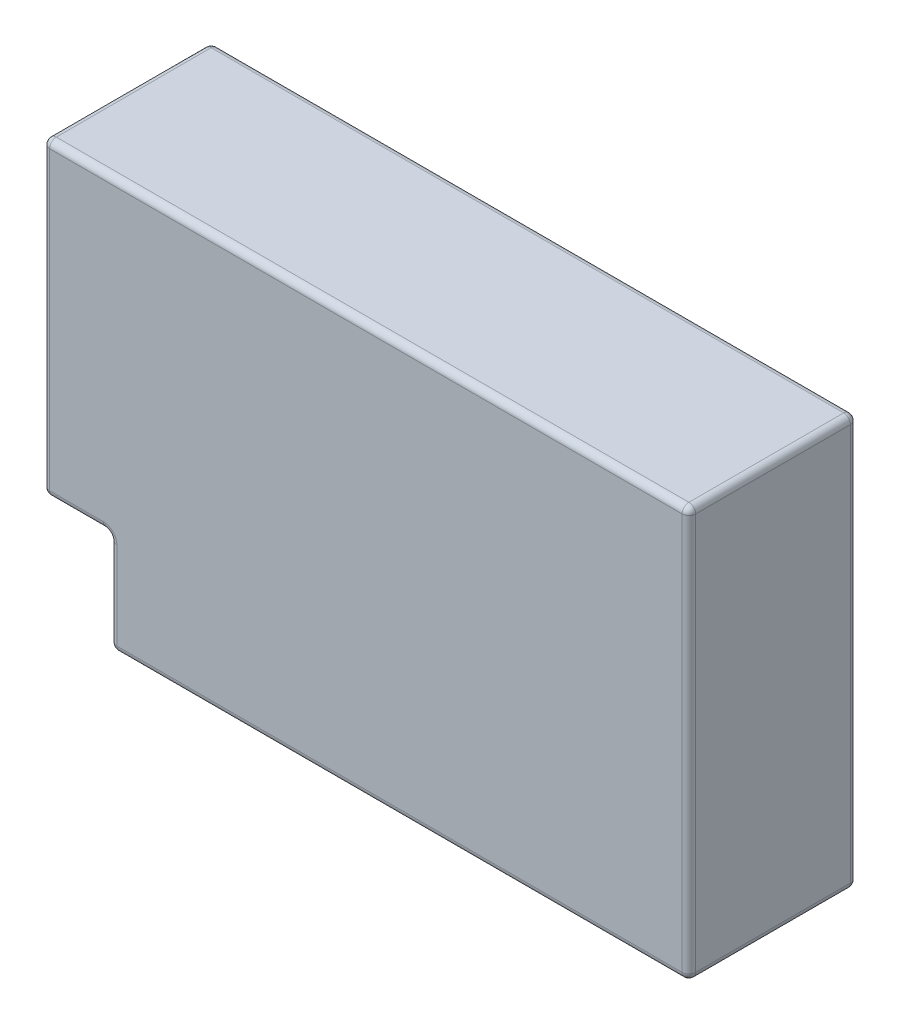
ISO-10303-21;
HEADER;
FILE_DESCRIPTION(('STEP AP214'),'2;1');
FILE_NAME('part.step','',(''),(''),'','','');
FILE_SCHEMA(('AUTOMOTIVE_DESIGN { 1 0 10303 214 1 1 1 1 }'));
ENDSEC;
DATA;
#1=APPLICATION_CONTEXT('core data for automotive mechanical design processes');
#2=APPLICATION_PROTOCOL_DEFINITION('international standard','automotive_design',2000,#1);
#3=PRODUCT_CONTEXT('',#1,'mechanical');
#4=PRODUCT('Part','Part','',(#3));
#5=PRODUCT_RELATED_PRODUCT_CATEGORY('part','',(#4));
#6=PRODUCT_DEFINITION_FORMATION('','',#4);
#7=PRODUCT_DEFINITION_CONTEXT('part definition',#1,'design');
#8=PRODUCT_DEFINITION('design','',#6,#7);
#9=PRODUCT_DEFINITION_SHAPE('','',#8);
#10=(LENGTH_UNIT() NAMED_UNIT(*) SI_UNIT(.MILLI.,.METRE.));
#11=(NAMED_UNIT(*) PLANE_ANGLE_UNIT() SI_UNIT($,.RADIAN.));
#12=(NAMED_UNIT(*) SI_UNIT($,.STERADIAN.) SOLID_ANGLE_UNIT());
#13=UNCERTAINTY_MEASURE_WITH_UNIT(LENGTH_MEASURE(1.E-05),#10,'distance_accuracy_value','');
#14=(GEOMETRIC_REPRESENTATION_CONTEXT(3) GLOBAL_UNCERTAINTY_ASSIGNED_CONTEXT((#13)) GLOBAL_UNIT_ASSIGNED_CONTEXT((#10,
#11,#12)) REPRESENTATION_CONTEXT('',''));
#15=CARTESIAN_POINT('',(0.,0.,0.));
#16=DIRECTION('',(0.,0.,1.));
#17=DIRECTION('',(1.,0.,0.));
#18=AXIS2_PLACEMENT_3D('',#15,#16,#17);
#19=CARTESIAN_POINT('',(-34.4784061836818,29.89401972873,25.));
#20=DIRECTION('',(0.,-1.,0.));
#21=DIRECTION('',(0.,0.,-1.));
#22=AXIS2_PLACEMENT_3D('',#19,#20,#21);
#23=PLANE('',#22);
#24=DIRECTION('',(0.,0.,-1.));
#25=VECTOR('',#24,1.);
#26=CARTESIAN_POINT('',(-33.4784061836818,29.89401972873,25.));
#27=LINE('',#26,#25);
#28=CARTESIAN_POINT('',(-33.4784061836818,29.89401972873,1.));
#29=VERTEX_POINT('',#28);
#30=CARTESIAN_POINT('',(-33.4784061836818,29.89401972873,24.));
#31=VERTEX_POINT('',#30);
#32=EDGE_CURVE('E170',#29,#31,#27,.F.);
#33=ORIENTED_EDGE('',*,*,#32,.T.);
#34=DIRECTION('',(-1.,0.,0.));
#35=VECTOR('',#34,1.);
#36=CARTESIAN_POINT('',(-34.4784061836818,29.89401972873,24.));
#37=LINE('',#36,#35);
#38=CARTESIAN_POINT('',(60.5215938163182,29.89401972873,24.));
#39=VERTEX_POINT('',#38);
#40=EDGE_CURVE('E207',#31,#39,#37,.F.);
#41=ORIENTED_EDGE('',*,*,#40,.T.);
#42=DIRECTION('',(0.,0.,-1.));
#43=VECTOR('',#42,1.);
#44=CARTESIAN_POINT('',(60.5215938163182,29.89401972873,25.));
#45=LINE('',#44,#43);
#46=CARTESIAN_POINT('',(60.5215938163182,29.89401972873,1.));
#47=VERTEX_POINT('',#46);
#48=EDGE_CURVE('E204',#39,#47,#45,.T.);
#49=ORIENTED_EDGE('',*,*,#48,.T.);
#50=DIRECTION('',(-1.,0.,0.));
#51=VECTOR('',#50,1.);
#52=CARTESIAN_POINT('',(-34.4784061836818,29.89401972873,1.));
#53=LINE('',#52,#51);
#54=EDGE_CURVE('E199',#47,#29,#53,.T.);
#55=ORIENTED_EDGE('',*,*,#54,.T.);
#56=EDGE_LOOP('',(#33,#41,#49,#55));
#57=FACE_BOUND('',#56,.T.);
#58=ADVANCED_FACE('F33',(#57),#23,.F.);
#59=CARTESIAN_POINT('',(-34.4784061836818,29.89401972873,25.));
#60=DIRECTION('',(1.,0.,0.));
#61=DIRECTION('',(0.,0.,-1.));
#62=AXIS2_PLACEMENT_3D('',#59,#60,#61);
#63=PLANE('',#62);
#64=DIRECTION('',(0.,0.,-1.));
#65=VECTOR('',#64,1.);
#66=CARTESIAN_POINT('',(-34.4784061836818,-15.10598027127,25.));
#67=LINE('',#66,#65);
#68=CARTESIAN_POINT('',(-34.4784061836818,-15.10598027127,1.));
#69=VERTEX_POINT('',#68);
#70=CARTESIAN_POINT('',(-34.4784061836818,-15.10598027127,24.));
#71=VERTEX_POINT('',#70);
#72=EDGE_CURVE('E192',#69,#71,#67,.F.);
#73=ORIENTED_EDGE('',*,*,#72,.T.);
#74=DIRECTION('',(0.,-1.,0.));
#75=VECTOR('',#74,1.);
#76=CARTESIAN_POINT('',(-34.4784061836818,29.89401972873,24.));
#77=LINE('',#76,#75);
#78=CARTESIAN_POINT('',(-34.4784061836818,28.89401972873,24.));
#79=VERTEX_POINT('',#78);
#80=EDGE_CURVE('E196',#71,#79,#77,.F.);
#81=ORIENTED_EDGE('',*,*,#80,.T.);
#82=DIRECTION('',(0.,0.,-1.));
#83=VECTOR('',#82,1.);
#84=CARTESIAN_POINT('',(-34.4784061836818,28.89401972873,25.));
#85=LINE('',#84,#83);
#86=CARTESIAN_POINT('',(-34.4784061836818,28.89401972873,1.));
#87=VERTEX_POINT('',#86);
#88=EDGE_CURVE('E168',#79,#87,#85,.T.);
#89=ORIENTED_EDGE('',*,*,#88,.T.);
#90=DIRECTION('',(0.,-1.,0.));
#91=VECTOR('',#90,1.);
#92=CARTESIAN_POINT('',(-34.4784061836818,-16.10598027127,1.));
#93=LINE('',#92,#91);
#94=EDGE_CURVE('E186',#87,#69,#93,.T.);
#95=ORIENTED_EDGE('',*,*,#94,.T.);
#96=EDGE_LOOP('',(#73,#81,#89,#95));
#97=FACE_BOUND('',#96,.T.);
#98=ADVANCED_FACE('F194',(#97),#63,.F.);
#99=CARTESIAN_POINT('',(-34.4784061836818,-16.10598027127,25.));
#100=DIRECTION('',(0.,1.,0.));
#101=DIRECTION('',(0.,0.,1.));
#102=AXIS2_PLACEMENT_3D('',#99,#100,#101);
#103=PLANE('',#102);
#104=DIRECTION('',(0.,0.,-1.));
#105=VECTOR('',#104,1.);
#106=CARTESIAN_POINT('',(-25.4784061836818,-16.10598027127,25.));
#107=LINE('',#106,#105);
#108=CARTESIAN_POINT('',(-25.4784061836818,-16.10598027127,1.));
#109=VERTEX_POINT('',#108);
#110=CARTESIAN_POINT('',(-25.4784061836818,-16.10598027127,24.));
#111=VERTEX_POINT('',#110);
#112=EDGE_CURVE('E211',#109,#111,#107,.F.);
#113=ORIENTED_EDGE('',*,*,#112,.T.);
#114=DIRECTION('',(1.,0.,0.));
#115=VECTOR('',#114,1.);
#116=CARTESIAN_POINT('',(-34.4784061836818,-16.10598027127,24.));
#117=LINE('',#116,#115);
#118=CARTESIAN_POINT('',(-33.4784061836818,-16.10598027127,24.));
#119=VERTEX_POINT('',#118);
#120=EDGE_CURVE('E216',#111,#119,#117,.F.);
#121=ORIENTED_EDGE('',*,*,#120,.T.);
#122=DIRECTION('',(0.,0.,-1.));
#123=VECTOR('',#122,1.);
#124=CARTESIAN_POINT('',(-33.4784061836818,-16.10598027127,25.));
#125=LINE('',#124,#123);
#126=CARTESIAN_POINT('',(-33.4784061836818,-16.10598027127,1.));
#127=VERTEX_POINT('',#126);
#128=EDGE_CURVE('E213',#119,#127,#125,.T.);
#129=ORIENTED_EDGE('',*,*,#128,.T.);
#130=DIRECTION('',(1.,0.,0.));
#131=VECTOR('',#130,1.);
#132=CARTESIAN_POINT('',(-24.4784061836818,-16.10598027127,1.));
#133=LINE('',#132,#131);
#134=EDGE_CURVE('E209',#127,#109,#133,.T.);
#135=ORIENTED_EDGE('',*,*,#134,.T.);
#136=EDGE_LOOP('',(#113,#121,#129,#135));
#137=FACE_BOUND('',#136,.T.);
#138=ADVANCED_FACE('F456',(#137),#103,.F.);
#139=CARTESIAN_POINT('',(-24.4784061836818,-31.10598027127,25.));
#140=DIRECTION('',(1.,0.,0.));
#141=DIRECTION('',(0.,0.,-1.));
#142=AXIS2_PLACEMENT_3D('',#139,#140,#141);
#143=PLANE('',#142);
#144=DIRECTION('',(0.,0.,-1.));
#145=VECTOR('',#144,1.);
#146=CARTESIAN_POINT('',(-24.4784061836818,-30.10598027127,25.));
#147=LINE('',#146,#145);
#148=CARTESIAN_POINT('',(-24.4784061836818,-30.10598027127,1.));
#149=VERTEX_POINT('',#148);
#150=CARTESIAN_POINT('',(-24.4784061836818,-30.10598027127,24.));
#151=VERTEX_POINT('',#150);
#152=EDGE_CURVE('E220',#149,#151,#147,.F.);
#153=ORIENTED_EDGE('',*,*,#152,.T.);
#154=DIRECTION('',(0.,-1.,0.));
#155=VECTOR('',#154,1.);
#156=CARTESIAN_POINT('',(-24.4784061836818,-31.10598027127,24.));
#157=LINE('',#156,#155);
#158=CARTESIAN_POINT('',(-24.4784061836818,-17.10598027127,24.));
#159=VERTEX_POINT('',#158);
#160=EDGE_CURVE('E225',#151,#159,#157,.F.);
#161=ORIENTED_EDGE('',*,*,#160,.T.);
#162=DIRECTION('',(0.,0.,-1.));
#163=VECTOR('',#162,1.);
#164=CARTESIAN_POINT('',(-24.4784061836818,-17.10598027127,0.));
#165=LINE('',#164,#163);
#166=CARTESIAN_POINT('',(-24.4784061836818,-17.10598027127,1.));
#167=VERTEX_POINT('',#166);
#168=EDGE_CURVE('E222',#159,#167,#165,.T.);
#169=ORIENTED_EDGE('',*,*,#168,.T.);
#170=DIRECTION('',(0.,-1.,0.));
#171=VECTOR('',#170,1.);
#172=CARTESIAN_POINT('',(-24.4784061836818,-31.10598027127,1.));
#173=LINE('',#172,#171);
#174=EDGE_CURVE('E218',#167,#149,#173,.T.);
#175=ORIENTED_EDGE('',*,*,#174,.T.);
#176=EDGE_LOOP('',(#153,#161,#169,#175));
#177=FACE_BOUND('',#176,.T.);
#178=ADVANCED_FACE('F390',(#177),#143,.F.);
#179=CARTESIAN_POINT('',(-24.4784061836818,-31.10598027127,25.));
#180=DIRECTION('',(0.,1.,0.));
#181=DIRECTION('',(0.,0.,1.));
#182=AXIS2_PLACEMENT_3D('',#179,#180,#181);
#183=PLANE('',#182);
#184=DIRECTION('',(0.,0.,-1.));
#185=VECTOR('',#184,1.);
#186=CARTESIAN_POINT('',(60.5215938163182,-31.10598027127,25.));
#187=LINE('',#186,#185);
#188=CARTESIAN_POINT('',(60.5215938163182,-31.10598027127,1.));
#189=VERTEX_POINT('',#188);
#190=CARTESIAN_POINT('',(60.5215938163182,-31.10598027127,24.));
#191=VERTEX_POINT('',#190);
#192=EDGE_CURVE('E229',#189,#191,#187,.F.);
#193=ORIENTED_EDGE('',*,*,#192,.T.);
#194=DIRECTION('',(1.,0.,0.));
#195=VECTOR('',#194,1.);
#196=CARTESIAN_POINT('',(-24.4784061836818,-31.10598027127,24.));
#197=LINE('',#196,#195);
#198=CARTESIAN_POINT('',(-23.4784061836818,-31.10598027127,24.));
#199=VERTEX_POINT('',#198);
#200=EDGE_CURVE('E234',#191,#199,#197,.F.);
#201=ORIENTED_EDGE('',*,*,#200,.T.);
#202=DIRECTION('',(0.,0.,-1.));
#203=VECTOR('',#202,1.);
#204=CARTESIAN_POINT('',(-23.4784061836818,-31.10598027127,25.));
#205=LINE('',#204,#203);
#206=CARTESIAN_POINT('',(-23.4784061836818,-31.10598027127,1.));
#207=VERTEX_POINT('',#206);
#208=EDGE_CURVE('E231',#199,#207,#205,.T.);
#209=ORIENTED_EDGE('',*,*,#208,.T.);
#210=DIRECTION('',(1.,0.,0.));
#211=VECTOR('',#210,1.);
#212=CARTESIAN_POINT('',(61.5215938163182,-31.10598027127,1.));
#213=LINE('',#212,#211);
#214=EDGE_CURVE('E227',#207,#189,#213,.T.);
#215=ORIENTED_EDGE('',*,*,#214,.T.);
#216=EDGE_LOOP('',(#193,#201,#209,#215));
#217=FACE_BOUND('',#216,.T.);
#218=ADVANCED_FACE('F404',(#217),#183,.F.);
#219=CARTESIAN_POINT('',(61.5215938163182,29.89401972873,25.));
#220=DIRECTION('',(-1.,0.,0.));
#221=DIRECTION('',(0.,-1.,0.));
#222=AXIS2_PLACEMENT_3D('',#219,#220,#221);
#223=PLANE('',#222);
#224=DIRECTION('',(0.,0.,-1.));
#225=VECTOR('',#224,1.);
#226=CARTESIAN_POINT('',(61.5215938163182,28.89401972873,25.));
#227=LINE('',#226,#225);
#228=CARTESIAN_POINT('',(61.5215938163182,28.89401972873,1.));
#229=VERTEX_POINT('',#228);
#230=CARTESIAN_POINT('',(61.5215938163182,28.89401972873,24.));
#231=VERTEX_POINT('',#230);
#232=EDGE_CURVE('E238',#229,#231,#227,.F.);
#233=ORIENTED_EDGE('',*,*,#232,.T.);
#234=DIRECTION('',(0.,1.,0.));
#235=VECTOR('',#234,1.);
#236=CARTESIAN_POINT('',(61.5215938163182,29.89401972873,24.));
#237=LINE('',#236,#235);
#238=CARTESIAN_POINT('',(61.5215938163182,-30.10598027127,24.));
#239=VERTEX_POINT('',#238);
#240=EDGE_CURVE('E243',#231,#239,#237,.F.);
#241=ORIENTED_EDGE('',*,*,#240,.T.);
#242=DIRECTION('',(0.,0.,-1.));
#243=VECTOR('',#242,1.);
#244=CARTESIAN_POINT('',(61.5215938163182,-30.10598027127,25.));
#245=LINE('',#244,#243);
#246=CARTESIAN_POINT('',(61.5215938163182,-30.10598027127,1.));
#247=VERTEX_POINT('',#246);
#248=EDGE_CURVE('E240',#239,#247,#245,.T.);
#249=ORIENTED_EDGE('',*,*,#248,.T.);
#250=DIRECTION('',(0.,1.,0.));
#251=VECTOR('',#250,1.);
#252=CARTESIAN_POINT('',(61.5215938163182,29.89401972873,1.));
#253=LINE('',#252,#251);
#254=EDGE_CURVE('E236',#247,#229,#253,.T.);
#255=ORIENTED_EDGE('',*,*,#254,.T.);
#256=EDGE_LOOP('',(#233,#241,#249,#255));
#257=FACE_BOUND('',#256,.T.);
#258=ADVANCED_FACE('F423',(#257),#223,.F.);
#259=CARTESIAN_POINT('',(0.,0.,25.));
#260=DIRECTION('',(0.,0.,-1.));
#261=DIRECTION('',(-1.,0.,0.));
#262=AXIS2_PLACEMENT_3D('',#259,#260,#261);
#263=PLANE('',#262);
#264=DIRECTION('',(0.,-1.,0.));
#265=VECTOR('',#264,1.);
#266=CARTESIAN_POINT('',(-23.4784061836818,0.,25.));
#267=LINE('',#266,#265);
#268=CARTESIAN_POINT('',(-23.4784061836818,-17.10598027127,25.));
#269=VERTEX_POINT('',#268);
#270=CARTESIAN_POINT('',(-23.4784061836818,-30.10598027127,25.));
#271=VERTEX_POINT('',#270);
#272=EDGE_CURVE('E257',#269,#271,#267,.T.);
#273=ORIENTED_EDGE('',*,*,#272,.T.);
#274=DIRECTION('',(1.,0.,0.));
#275=VECTOR('',#274,1.);
#276=CARTESIAN_POINT('',(0.,-30.10598027127,25.));
#277=LINE('',#276,#275);
#278=CARTESIAN_POINT('',(60.5215938163182,-30.10598027127,25.));
#279=VERTEX_POINT('',#278);
#280=EDGE_CURVE('E259',#271,#279,#277,.T.);
#281=ORIENTED_EDGE('',*,*,#280,.T.);
#282=DIRECTION('',(0.,1.,0.));
#283=VECTOR('',#282,1.);
#284=CARTESIAN_POINT('',(60.5215938163182,0.,25.));
#285=LINE('',#284,#283);
#286=CARTESIAN_POINT('',(60.5215938163182,28.89401972873,25.));
#287=VERTEX_POINT('',#286);
#288=EDGE_CURVE('E251',#279,#287,#285,.T.);
#289=ORIENTED_EDGE('',*,*,#288,.T.);
#290=DIRECTION('',(-1.,0.,0.));
#291=VECTOR('',#290,1.);
#292=CARTESIAN_POINT('',(0.,28.89401972873,25.));
#293=LINE('',#292,#291);
#294=CARTESIAN_POINT('',(-33.4784061836818,28.89401972873,25.));
#295=VERTEX_POINT('',#294);
#296=EDGE_CURVE('E245',#287,#295,#293,.T.);
#297=ORIENTED_EDGE('',*,*,#296,.T.);
#298=DIRECTION('',(0.,-1.,0.));
#299=VECTOR('',#298,1.);
#300=CARTESIAN_POINT('',(-33.4784061836818,0.,25.));
#301=LINE('',#300,#299);
#302=CARTESIAN_POINT('',(-33.4784061836818,-15.10598027127,25.));
#303=VERTEX_POINT('',#302);
#304=EDGE_CURVE('E247',#295,#303,#301,.T.);
#305=ORIENTED_EDGE('',*,*,#304,.T.);
#306=DIRECTION('',(1.,0.,0.));
#307=VECTOR('',#306,1.);
#308=CARTESIAN_POINT('',(0.,-15.10598027127,25.));
#309=LINE('',#308,#307);
#310=CARTESIAN_POINT('',(-25.4784061836818,-15.10598027127,25.));
#311=VERTEX_POINT('',#310);
#312=EDGE_CURVE('E249',#303,#311,#309,.T.);
#313=ORIENTED_EDGE('',*,*,#312,.T.);
#314=CARTESIAN_POINT('',(-25.4784061836818,-17.10598027127,25.));
#315=DIRECTION('',(0.,0.,-1.));
#316=DIRECTION('',(-1.,0.,0.));
#317=AXIS2_PLACEMENT_3D('',#314,#315,#316);
#318=CIRCLE('',#317,2.);
#319=EDGE_CURVE('E254',#269,#311,#318,.F.);
#320=ORIENTED_EDGE('',*,*,#319,.F.);
#321=EDGE_LOOP('',(#273,#281,#289,#297,#305,#313,#320));
#322=FACE_BOUND('',#321,.T.);
#323=ADVANCED_FACE('F382',(#322),#263,.F.);
#324=CARTESIAN_POINT('',(0.,0.,0.));
#325=DIRECTION('',(0.,0.,-1.));
#326=DIRECTION('',(-1.,0.,0.));
#327=AXIS2_PLACEMENT_3D('',#324,#325,#326);
#328=PLANE('',#327);
#329=CARTESIAN_POINT('',(-25.4784061836818,-17.10598027127,0.));
#330=DIRECTION('',(0.,0.,-1.));
#331=DIRECTION('',(-1.,0.,0.));
#332=AXIS2_PLACEMENT_3D('',#329,#330,#331);
#333=CIRCLE('',#332,2.);
#334=CARTESIAN_POINT('',(-25.4784061836818,-15.10598027127,0.));
#335=VERTEX_POINT('',#334);
#336=CARTESIAN_POINT('',(-23.4784061836818,-17.10598027127,0.));
#337=VERTEX_POINT('',#336);
#338=EDGE_CURVE('E42',#335,#337,#333,.T.);
#339=ORIENTED_EDGE('',*,*,#338,.F.);
#340=DIRECTION('',(1.,0.,0.));
#341=VECTOR('',#340,1.);
#342=CARTESIAN_POINT('',(-34.4784061836818,-15.10598027127,0.));
#343=LINE('',#342,#341);
#344=CARTESIAN_POINT('',(-33.4784061836818,-15.10598027127,0.));
#345=VERTEX_POINT('',#344);
#346=EDGE_CURVE('E11',#335,#345,#343,.F.);
#347=ORIENTED_EDGE('',*,*,#346,.T.);
#348=DIRECTION('',(0.,-1.,0.));
#349=VECTOR('',#348,1.);
#350=CARTESIAN_POINT('',(-33.4784061836818,29.89401972873,0.));
#351=LINE('',#350,#349);
#352=CARTESIAN_POINT('',(-33.4784061836818,28.89401972873,0.));
#353=VERTEX_POINT('',#352);
#354=EDGE_CURVE('E269',#345,#353,#351,.F.);
#355=ORIENTED_EDGE('',*,*,#354,.T.);
#356=DIRECTION('',(-1.,0.,0.));
#357=VECTOR('',#356,1.);
#358=CARTESIAN_POINT('',(61.5215938163182,28.89401972873,0.));
#359=LINE('',#358,#357);
#360=CARTESIAN_POINT('',(60.5215938163182,28.89401972873,0.));
#361=VERTEX_POINT('',#360);
#362=EDGE_CURVE('E261',#353,#361,#359,.F.);
#363=ORIENTED_EDGE('',*,*,#362,.T.);
#364=DIRECTION('',(0.,1.,0.));
#365=VECTOR('',#364,1.);
#366=CARTESIAN_POINT('',(60.5215938163182,-31.10598027127,0.));
#367=LINE('',#366,#365);
#368=CARTESIAN_POINT('',(60.5215938163182,-30.10598027127,0.));
#369=VERTEX_POINT('',#368);
#370=EDGE_CURVE('E263',#361,#369,#367,.F.);
#371=ORIENTED_EDGE('',*,*,#370,.T.);
#372=DIRECTION('',(1.,0.,0.));
#373=VECTOR('',#372,1.);
#374=CARTESIAN_POINT('',(-24.4784061836818,-30.10598027127,0.));
#375=LINE('',#374,#373);
#376=CARTESIAN_POINT('',(-23.4784061836818,-30.10598027127,0.));
#377=VERTEX_POINT('',#376);
#378=EDGE_CURVE('E265',#369,#377,#375,.F.);
#379=ORIENTED_EDGE('',*,*,#378,.T.);
#380=DIRECTION('',(0.,-1.,0.));
#381=VECTOR('',#380,1.);
#382=CARTESIAN_POINT('',(-23.4784061836818,-16.10598027127,0.));
#383=LINE('',#382,#381);
#384=EDGE_CURVE('E267',#377,#337,#383,.F.);
#385=ORIENTED_EDGE('',*,*,#384,.T.);
#386=EDGE_LOOP('',(#339,#347,#355,#363,#371,#379,#385));
#387=FACE_BOUND('',#386,.T.);
#388=ADVANCED_FACE('F521',(#387),#328,.T.);
#389=CARTESIAN_POINT('',(-23.4784061836818,-30.10598027127,25.));
#390=DIRECTION('',(0.,0.,-1.));
#391=DIRECTION('',(-1.,0.,0.));
#392=AXIS2_PLACEMENT_3D('',#389,#390,#391);
#393=CYLINDRICAL_SURFACE('',#392,1.);
#394=CARTESIAN_POINT('',(-23.4784061836818,-30.10598027127,24.));
#395=DIRECTION('',(0.,0.,1.));
#396=DIRECTION('',(1.,0.,0.));
#397=AXIS2_PLACEMENT_3D('',#394,#395,#396);
#398=CIRCLE('',#397,1.);
#399=EDGE_CURVE('E37',#151,#199,#398,.T.);
#400=ORIENTED_EDGE('',*,*,#399,.F.);
#401=ORIENTED_EDGE('',*,*,#152,.F.);
#402=CARTESIAN_POINT('',(-23.4784061836818,-30.10598027127,1.));
#403=DIRECTION('',(0.,0.,-1.));
#404=DIRECTION('',(-1.,0.,0.));
#405=AXIS2_PLACEMENT_3D('',#402,#403,#404);
#406=CIRCLE('',#405,1.);
#407=EDGE_CURVE('E358',#207,#149,#406,.T.);
#408=ORIENTED_EDGE('',*,*,#407,.F.);
#409=ORIENTED_EDGE('',*,*,#208,.F.);
#410=EDGE_LOOP('',(#400,#401,#408,#409));
#411=FACE_BOUND('',#410,.T.);
#412=ADVANCED_FACE('F35',(#411),#393,.T.);
#413=CARTESIAN_POINT('',(-23.4784061836818,-30.10598027127,24.));
#414=DIRECTION('',(0.,0.,1.));
#415=DIRECTION('',(1.,0.,0.));
#416=AXIS2_PLACEMENT_3D('',#413,#414,#415);
#417=SPHERICAL_SURFACE('',#416,1.);
#418=CARTESIAN_POINT('',(-23.4784061836818,-30.10598027127,24.));
#419=DIRECTION('',(0.,-1.,0.));
#420=DIRECTION('',(0.,0.,-1.));
#421=AXIS2_PLACEMENT_3D('',#418,#419,#420);
#422=CIRCLE('',#421,1.);
#423=EDGE_CURVE('E353',#151,#271,#422,.F.);
#424=ORIENTED_EDGE('',*,*,#423,.F.);
#425=ORIENTED_EDGE('',*,*,#399,.T.);
#426=CARTESIAN_POINT('',(-23.4784061836818,-30.10598027127,24.));
#427=DIRECTION('',(-1.,0.,0.));
#428=DIRECTION('',(0.,0.,1.));
#429=AXIS2_PLACEMENT_3D('',#426,#427,#428);
#430=CIRCLE('',#429,1.);
#431=EDGE_CURVE('E356',#271,#199,#430,.F.);
#432=ORIENTED_EDGE('',*,*,#431,.F.);
#433=EDGE_LOOP('',(#424,#425,#432));
#434=FACE_BOUND('',#433,.T.);
#435=ADVANCED_FACE('F369',(#434),#417,.T.);
#436=CARTESIAN_POINT('',(-23.4784061836818,-30.10598027127,1.));
#437=DIRECTION('',(0.,0.,1.));
#438=DIRECTION('',(1.,0.,0.));
#439=AXIS2_PLACEMENT_3D('',#436,#437,#438);
#440=SPHERICAL_SURFACE('',#439,1.);
#441=CARTESIAN_POINT('',(-23.4784061836818,-30.10598027127,1.));
#442=DIRECTION('',(-1.,0.,0.));
#443=DIRECTION('',(0.,0.,1.));
#444=AXIS2_PLACEMENT_3D('',#441,#442,#443);
#445=CIRCLE('',#444,1.);
#446=EDGE_CURVE('E347',#207,#377,#445,.F.);
#447=ORIENTED_EDGE('',*,*,#446,.F.);
#448=ORIENTED_EDGE('',*,*,#407,.T.);
#449=CARTESIAN_POINT('',(-23.4784061836818,-30.10598027127,1.));
#450=DIRECTION('',(0.,-1.,0.));
#451=DIRECTION('',(0.,0.,-1.));
#452=AXIS2_PLACEMENT_3D('',#449,#450,#451);
#453=CIRCLE('',#452,1.);
#454=EDGE_CURVE('E350',#377,#149,#453,.F.);
#455=ORIENTED_EDGE('',*,*,#454,.F.);
#456=EDGE_LOOP('',(#447,#448,#455));
#457=FACE_BOUND('',#456,.T.);
#458=ADVANCED_FACE('F566',(#457),#440,.T.);
#459=CARTESIAN_POINT('',(0.,-30.10598027127,24.));
#460=DIRECTION('',(1.,0.,0.));
#461=DIRECTION('',(0.,0.,-1.));
#462=AXIS2_PLACEMENT_3D('',#459,#460,#461);
#463=CYLINDRICAL_SURFACE('',#462,1.);
#464=ORIENTED_EDGE('',*,*,#431,.T.);
#465=ORIENTED_EDGE('',*,*,#200,.F.);
#466=CARTESIAN_POINT('',(60.5215938163182,-30.10598027127,24.));
#467=DIRECTION('',(1.,0.,0.));
#468=DIRECTION('',(0.,0.,-1.));
#469=AXIS2_PLACEMENT_3D('',#466,#467,#468);
#470=CIRCLE('',#469,1.);
#471=EDGE_CURVE('E341',#279,#191,#470,.T.);
#472=ORIENTED_EDGE('',*,*,#471,.F.);
#473=ORIENTED_EDGE('',*,*,#280,.F.);
#474=EDGE_LOOP('',(#464,#465,#472,#473));
#475=FACE_BOUND('',#474,.T.);
#476=ADVANCED_FACE('F377',(#475),#463,.T.);
#477=CARTESIAN_POINT('',(-23.4784061836818,0.,24.));
#478=DIRECTION('',(0.,-1.,0.));
#479=DIRECTION('',(0.,0.,-1.));
#480=AXIS2_PLACEMENT_3D('',#477,#478,#479);
#481=CYLINDRICAL_SURFACE('',#480,1.);
#482=ORIENTED_EDGE('',*,*,#423,.T.);
#483=ORIENTED_EDGE('',*,*,#272,.F.);
#484=CARTESIAN_POINT('',(-23.4784061836818,-17.10598027127,24.));
#485=DIRECTION('',(0.,1.,0.));
#486=DIRECTION('',(0.,0.,1.));
#487=AXIS2_PLACEMENT_3D('',#484,#485,#486);
#488=CIRCLE('',#487,1.);
#489=EDGE_CURVE('E338',#159,#269,#488,.T.);
#490=ORIENTED_EDGE('',*,*,#489,.F.);
#491=ORIENTED_EDGE('',*,*,#160,.F.);
#492=EDGE_LOOP('',(#482,#483,#490,#491));
#493=FACE_BOUND('',#492,.T.);
#494=ADVANCED_FACE('F387',(#493),#481,.T.);
#495=CARTESIAN_POINT('',(-25.4784061836818,-17.10598027127,25.));
#496=DIRECTION('',(0.,0.,1.));
#497=DIRECTION('',(1.,0.,0.));
#498=AXIS2_PLACEMENT_3D('',#495,#496,#497);
#499=CYLINDRICAL_SURFACE('',#498,1.);
#500=CARTESIAN_POINT('',(-25.4784061836818,-17.10598027127,1.));
#501=DIRECTION('',(0.,0.,-1.));
#502=DIRECTION('',(-1.,0.,0.));
#503=AXIS2_PLACEMENT_3D('',#500,#501,#502);
#504=CIRCLE('',#503,1.);
#505=EDGE_CURVE('E332',#167,#109,#504,.F.);
#506=ORIENTED_EDGE('',*,*,#505,.F.);
#507=ORIENTED_EDGE('',*,*,#168,.F.);
#508=CARTESIAN_POINT('',(-25.4784061836818,-17.10598027127,24.));
#509=DIRECTION('',(0.,0.,-1.));
#510=DIRECTION('',(-1.,0.,0.));
#511=AXIS2_PLACEMENT_3D('',#508,#509,#510);
#512=CIRCLE('',#511,1.);
#513=EDGE_CURVE('E335',#111,#159,#512,.T.);
#514=ORIENTED_EDGE('',*,*,#513,.F.);
#515=ORIENTED_EDGE('',*,*,#112,.F.);
#516=EDGE_LOOP('',(#506,#507,#514,#515));
#517=FACE_BOUND('',#516,.T.);
#518=ADVANCED_FACE('F394',(#517),#499,.F.);
#519=CARTESIAN_POINT('',(-23.4784061836818,-31.10598027127,1.));
#520=DIRECTION('',(0.,1.,0.));
#521=DIRECTION('',(0.,0.,1.));
#522=AXIS2_PLACEMENT_3D('',#519,#520,#521);
#523=CYLINDRICAL_SURFACE('',#522,1.);
#524=ORIENTED_EDGE('',*,*,#454,.T.);
#525=ORIENTED_EDGE('',*,*,#174,.F.);
#526=CARTESIAN_POINT('',(-23.4784061836818,-17.10598027127,1.));
#527=DIRECTION('',(0.,1.,0.));
#528=DIRECTION('',(0.,0.,1.));
#529=AXIS2_PLACEMENT_3D('',#526,#527,#528);
#530=CIRCLE('',#529,1.);
#531=EDGE_CURVE('E330',#337,#167,#530,.T.);
#532=ORIENTED_EDGE('',*,*,#531,.F.);
#533=ORIENTED_EDGE('',*,*,#384,.F.);
#534=EDGE_LOOP('',(#524,#525,#532,#533));
#535=FACE_BOUND('',#534,.T.);
#536=ADVANCED_FACE('F401',(#535),#523,.T.);
#537=CARTESIAN_POINT('',(-24.4784061836818,-30.10598027127,1.));
#538=DIRECTION('',(-1.,0.,0.));
#539=DIRECTION('',(0.,0.,1.));
#540=AXIS2_PLACEMENT_3D('',#537,#538,#539);
#541=CYLINDRICAL_SURFACE('',#540,1.);
#542=ORIENTED_EDGE('',*,*,#446,.T.);
#543=ORIENTED_EDGE('',*,*,#378,.F.);
#544=CARTESIAN_POINT('',(60.5215938163182,-30.10598027127,1.));
#545=DIRECTION('',(1.,0.,0.));
#546=DIRECTION('',(0.,0.,-1.));
#547=AXIS2_PLACEMENT_3D('',#544,#545,#546);
#548=CIRCLE('',#547,1.);
#549=EDGE_CURVE('E327',#189,#369,#548,.T.);
#550=ORIENTED_EDGE('',*,*,#549,.F.);
#551=ORIENTED_EDGE('',*,*,#214,.F.);
#552=EDGE_LOOP('',(#542,#543,#550,#551));
#553=FACE_BOUND('',#552,.T.);
#554=ADVANCED_FACE('F413',(#553),#541,.T.);
#555=CARTESIAN_POINT('',(60.5215938163182,-30.10598027127,25.));
#556=DIRECTION('',(0.,0.,-1.));
#557=DIRECTION('',(-1.,0.,0.));
#558=AXIS2_PLACEMENT_3D('',#555,#556,#557);
#559=CYLINDRICAL_SURFACE('',#558,1.);
#560=CARTESIAN_POINT('',(60.5215938163182,-30.10598027127,24.));
#561=DIRECTION('',(0.,0.,1.));
#562=DIRECTION('',(1.,0.,0.));
#563=AXIS2_PLACEMENT_3D('',#560,#561,#562);
#564=CIRCLE('',#563,1.);
#565=EDGE_CURVE('E344',#191,#239,#564,.T.);
#566=ORIENTED_EDGE('',*,*,#565,.F.);
#567=ORIENTED_EDGE('',*,*,#192,.F.);
#568=CARTESIAN_POINT('',(60.5215938163182,-30.10598027127,1.));
#569=DIRECTION('',(0.,0.,-1.));
#570=DIRECTION('',(-1.,0.,0.));
#571=AXIS2_PLACEMENT_3D('',#568,#569,#570);
#572=CIRCLE('',#571,1.);
#573=EDGE_CURVE('E324',#247,#189,#572,.T.);
#574=ORIENTED_EDGE('',*,*,#573,.F.);
#575=ORIENTED_EDGE('',*,*,#248,.F.);
#576=EDGE_LOOP('',(#566,#567,#574,#575));
#577=FACE_BOUND('',#576,.T.);
#578=ADVANCED_FACE('F409',(#577),#559,.T.);
#579=CARTESIAN_POINT('',(60.5215938163182,-30.10598027127,24.));
#580=DIRECTION('',(0.,0.,1.));
#581=DIRECTION('',(1.,0.,0.));
#582=AXIS2_PLACEMENT_3D('',#579,#580,#581);
#583=SPHERICAL_SURFACE('',#582,1.);
#584=ORIENTED_EDGE('',*,*,#471,.T.);
#585=ORIENTED_EDGE('',*,*,#565,.T.);
#586=CARTESIAN_POINT('',(60.5215938163182,-30.10598027127,24.));
#587=DIRECTION('',(0.,-1.,0.));
#588=DIRECTION('',(0.,0.,-1.));
#589=AXIS2_PLACEMENT_3D('',#586,#587,#588);
#590=CIRCLE('',#589,1.);
#591=EDGE_CURVE('E321',#279,#239,#590,.F.);
#592=ORIENTED_EDGE('',*,*,#591,.F.);
#593=EDGE_LOOP('',(#584,#585,#592));
#594=FACE_BOUND('',#593,.T.);
#595=ADVANCED_FACE('F438',(#594),#583,.T.);
#596=CARTESIAN_POINT('',(-25.4784061836818,-17.10598027127,24.));
#597=DIRECTION('',(0.,0.,-1.));
#598=DIRECTION('',(-1.,0.,0.));
#599=AXIS2_PLACEMENT_3D('',#596,#597,#598);
#600=TOROIDAL_SURFACE('',#599,2.,1.);
#601=ORIENTED_EDGE('',*,*,#489,.T.);
#602=ORIENTED_EDGE('',*,*,#319,.T.);
#603=CARTESIAN_POINT('',(-25.4784061836818,-15.10598027127,24.));
#604=DIRECTION('',(1.,0.,0.));
#605=DIRECTION('',(0.,0.,-1.));
#606=AXIS2_PLACEMENT_3D('',#603,#604,#605);
#607=CIRCLE('',#606,1.);
#608=EDGE_CURVE('E318',#111,#311,#607,.F.);
#609=ORIENTED_EDGE('',*,*,#608,.F.);
#610=ORIENTED_EDGE('',*,*,#513,.T.);
#611=EDGE_LOOP('',(#601,#602,#609,#610));
#612=FACE_BOUND('',#611,.T.);
#613=ADVANCED_FACE('F440',(#612),#600,.T.);
#614=CARTESIAN_POINT('',(-25.4784061836818,-17.10598027127,1.));
#615=DIRECTION('',(0.,0.,-1.));
#616=DIRECTION('',(-1.,0.,0.));
#617=AXIS2_PLACEMENT_3D('',#614,#615,#616);
#618=TOROIDAL_SURFACE('',#617,2.,1.);
#619=ORIENTED_EDGE('',*,*,#531,.T.);
#620=ORIENTED_EDGE('',*,*,#505,.T.);
#621=CARTESIAN_POINT('',(-25.4784061836818,-15.10598027127,1.));
#622=DIRECTION('',(1.,0.,0.));
#623=DIRECTION('',(0.,0.,-1.));
#624=AXIS2_PLACEMENT_3D('',#621,#622,#623);
#625=CIRCLE('',#624,1.);
#626=EDGE_CURVE('E315',#335,#109,#625,.F.);
#627=ORIENTED_EDGE('',*,*,#626,.F.);
#628=ORIENTED_EDGE('',*,*,#338,.T.);
#629=EDGE_LOOP('',(#619,#620,#627,#628));
#630=FACE_BOUND('',#629,.T.);
#631=ADVANCED_FACE('F446',(#630),#618,.T.);
#632=CARTESIAN_POINT('',(60.5215938163182,-30.10598027127,1.));
#633=DIRECTION('',(0.,0.,1.));
#634=DIRECTION('',(1.,0.,0.));
#635=AXIS2_PLACEMENT_3D('',#632,#633,#634);
#636=SPHERICAL_SURFACE('',#635,1.);
#637=ORIENTED_EDGE('',*,*,#573,.T.);
#638=ORIENTED_EDGE('',*,*,#549,.T.);
#639=CARTESIAN_POINT('',(60.5215938163182,-30.10598027127,1.));
#640=DIRECTION('',(0.,-1.,0.));
#641=DIRECTION('',(0.,0.,-1.));
#642=AXIS2_PLACEMENT_3D('',#639,#640,#641);
#643=CIRCLE('',#642,1.);
#644=EDGE_CURVE('E312',#247,#369,#643,.F.);
#645=ORIENTED_EDGE('',*,*,#644,.F.);
#646=EDGE_LOOP('',(#637,#638,#645));
#647=FACE_BOUND('',#646,.T.);
#648=ADVANCED_FACE('F416',(#647),#636,.T.);
#649=CARTESIAN_POINT('',(60.5215938163182,0.,24.));
#650=DIRECTION('',(0.,1.,0.));
#651=DIRECTION('',(-1.,0.,0.));
#652=AXIS2_PLACEMENT_3D('',#649,#650,#651);
#653=CYLINDRICAL_SURFACE('',#652,1.);
#654=ORIENTED_EDGE('',*,*,#591,.T.);
#655=ORIENTED_EDGE('',*,*,#240,.F.);
#656=CARTESIAN_POINT('',(60.5215938163182,28.89401972873,24.));
#657=DIRECTION('',(0.,1.,0.));
#658=DIRECTION('',(0.,0.,1.));
#659=AXIS2_PLACEMENT_3D('',#656,#657,#658);
#660=CIRCLE('',#659,1.);
#661=EDGE_CURVE('E306',#287,#231,#660,.T.);
#662=ORIENTED_EDGE('',*,*,#661,.F.);
#663=ORIENTED_EDGE('',*,*,#288,.F.);
#664=EDGE_LOOP('',(#654,#655,#662,#663));
#665=FACE_BOUND('',#664,.T.);
#666=ADVANCED_FACE('F436',(#665),#653,.T.);
#667=CARTESIAN_POINT('',(0.,-15.10598027127,24.));
#668=DIRECTION('',(1.,0.,0.));
#669=DIRECTION('',(0.,0.,-1.));
#670=AXIS2_PLACEMENT_3D('',#667,#668,#669);
#671=CYLINDRICAL_SURFACE('',#670,1.);
#672=ORIENTED_EDGE('',*,*,#608,.T.);
#673=ORIENTED_EDGE('',*,*,#312,.F.);
#674=CARTESIAN_POINT('',(-33.4784061836818,-15.10598027127,24.));
#675=DIRECTION('',(-1.,0.,0.));
#676=DIRECTION('',(0.,0.,1.));
#677=AXIS2_PLACEMENT_3D('',#674,#675,#676);
#678=CIRCLE('',#677,1.);
#679=EDGE_CURVE('E303',#119,#303,#678,.T.);
#680=ORIENTED_EDGE('',*,*,#679,.F.);
#681=ORIENTED_EDGE('',*,*,#120,.F.);
#682=EDGE_LOOP('',(#672,#673,#680,#681));
#683=FACE_BOUND('',#682,.T.);
#684=ADVANCED_FACE('F507',(#683),#671,.T.);
#685=CARTESIAN_POINT('',(-33.4784061836818,-15.10598027127,25.));
#686=DIRECTION('',(0.,0.,-1.));
#687=DIRECTION('',(-1.,0.,0.));
#688=AXIS2_PLACEMENT_3D('',#685,#686,#687);
#689=CYLINDRICAL_SURFACE('',#688,1.);
#690=CARTESIAN_POINT('',(-33.4784061836818,-15.10598027127,1.));
#691=DIRECTION('',(0.,0.,-1.));
#692=DIRECTION('',(-1.,0.,0.));
#693=AXIS2_PLACEMENT_3D('',#690,#691,#692);
#694=CIRCLE('',#693,1.);
#695=EDGE_CURVE('E297',#127,#69,#694,.T.);
#696=ORIENTED_EDGE('',*,*,#695,.F.);
#697=ORIENTED_EDGE('',*,*,#128,.F.);
#698=CARTESIAN_POINT('',(-33.4784061836818,-15.10598027127,24.));
#699=DIRECTION('',(0.,0.,1.));
#700=DIRECTION('',(1.,0.,0.));
#701=AXIS2_PLACEMENT_3D('',#698,#699,#700);
#702=CIRCLE('',#701,1.);
#703=EDGE_CURVE('E300',#71,#119,#702,.T.);
#704=ORIENTED_EDGE('',*,*,#703,.F.);
#705=ORIENTED_EDGE('',*,*,#72,.F.);
#706=EDGE_LOOP('',(#696,#697,#704,#705));
#707=FACE_BOUND('',#706,.T.);
#708=ADVANCED_FACE('F503',(#707),#689,.T.);
#709=CARTESIAN_POINT('',(-34.4784061836818,-15.10598027127,1.));
#710=DIRECTION('',(-1.,0.,0.));
#711=DIRECTION('',(0.,0.,1.));
#712=AXIS2_PLACEMENT_3D('',#709,#710,#711);
#713=CYLINDRICAL_SURFACE('',#712,1.);
#714=ORIENTED_EDGE('',*,*,#626,.T.);
#715=ORIENTED_EDGE('',*,*,#134,.F.);
#716=CARTESIAN_POINT('',(-33.4784061836818,-15.10598027127,1.));
#717=DIRECTION('',(-1.,0.,0.));
#718=DIRECTION('',(0.,0.,1.));
#719=AXIS2_PLACEMENT_3D('',#716,#717,#718);
#720=CIRCLE('',#719,1.);
#721=EDGE_CURVE('E295',#345,#127,#720,.T.);
#722=ORIENTED_EDGE('',*,*,#721,.F.);
#723=ORIENTED_EDGE('',*,*,#346,.F.);
#724=EDGE_LOOP('',(#714,#715,#722,#723));
#725=FACE_BOUND('',#724,.T.);
#726=ADVANCED_FACE('F500',(#725),#713,.T.);
#727=CARTESIAN_POINT('',(60.5215938163182,29.89401972873,1.));
#728=DIRECTION('',(0.,-1.,0.));
#729=DIRECTION('',(1.,0.,0.));
#730=AXIS2_PLACEMENT_3D('',#727,#728,#729);
#731=CYLINDRICAL_SURFACE('',#730,1.);
#732=ORIENTED_EDGE('',*,*,#644,.T.);
#733=ORIENTED_EDGE('',*,*,#370,.F.);
#734=CARTESIAN_POINT('',(60.5215938163182,28.89401972873,1.));
#735=DIRECTION('',(0.,1.,0.));
#736=DIRECTION('',(0.,0.,1.));
#737=AXIS2_PLACEMENT_3D('',#734,#735,#736);
#738=CIRCLE('',#737,1.);
#739=EDGE_CURVE('E292',#229,#361,#738,.T.);
#740=ORIENTED_EDGE('',*,*,#739,.F.);
#741=ORIENTED_EDGE('',*,*,#254,.F.);
#742=EDGE_LOOP('',(#732,#733,#740,#741));
#743=FACE_BOUND('',#742,.T.);
#744=ADVANCED_FACE('F419',(#743),#731,.T.);
#745=CARTESIAN_POINT('',(60.5215938163182,28.89401972873,25.));
#746=DIRECTION('',(0.,0.,-1.));
#747=DIRECTION('',(-1.,0.,0.));
#748=AXIS2_PLACEMENT_3D('',#745,#746,#747);
#749=CYLINDRICAL_SURFACE('',#748,1.);
#750=CARTESIAN_POINT('',(60.5215938163182,28.89401972873,24.));
#751=DIRECTION('',(0.,0.,1.));
#752=DIRECTION('',(1.,0.,0.));
#753=AXIS2_PLACEMENT_3D('',#750,#751,#752);
#754=CIRCLE('',#753,1.);
#755=EDGE_CURVE('E309',#231,#39,#754,.T.);
#756=ORIENTED_EDGE('',*,*,#755,.F.);
#757=ORIENTED_EDGE('',*,*,#232,.F.);
#758=CARTESIAN_POINT('',(60.5215938163182,28.89401972873,1.));
#759=DIRECTION('',(0.,0.,-1.));
#760=DIRECTION('',(-1.,0.,0.));
#761=AXIS2_PLACEMENT_3D('',#758,#759,#760);
#762=CIRCLE('',#761,1.);
#763=EDGE_CURVE('E289',#47,#229,#762,.T.);
#764=ORIENTED_EDGE('',*,*,#763,.F.);
#765=ORIENTED_EDGE('',*,*,#48,.F.);
#766=EDGE_LOOP('',(#756,#757,#764,#765));
#767=FACE_BOUND('',#766,.T.);
#768=ADVANCED_FACE('F428',(#767),#749,.T.);
#769=CARTESIAN_POINT('',(60.5215938163182,28.89401972873,24.));
#770=DIRECTION('',(0.,0.,1.));
#771=DIRECTION('',(1.,0.,0.));
#772=AXIS2_PLACEMENT_3D('',#769,#770,#771);
#773=SPHERICAL_SURFACE('',#772,1.);
#774=ORIENTED_EDGE('',*,*,#661,.T.);
#775=ORIENTED_EDGE('',*,*,#755,.T.);
#776=CARTESIAN_POINT('',(60.5215938163182,28.89401972873,24.));
#777=DIRECTION('',(1.,0.,0.));
#778=DIRECTION('',(0.,0.,-1.));
#779=AXIS2_PLACEMENT_3D('',#776,#777,#778);
#780=CIRCLE('',#779,1.);
#781=EDGE_CURVE('E286',#287,#39,#780,.F.);
#782=ORIENTED_EDGE('',*,*,#781,.F.);
#783=EDGE_LOOP('',(#774,#775,#782));
#784=FACE_BOUND('',#783,.T.);
#785=ADVANCED_FACE('F434',(#784),#773,.T.);
#786=CARTESIAN_POINT('',(-33.4784061836818,-15.10598027127,24.));
#787=DIRECTION('',(0.,0.,1.));
#788=DIRECTION('',(1.,0.,0.));
#789=AXIS2_PLACEMENT_3D('',#786,#787,#788);
#790=SPHERICAL_SURFACE('',#789,1.);
#791=ORIENTED_EDGE('',*,*,#703,.T.);
#792=ORIENTED_EDGE('',*,*,#679,.T.);
#793=CARTESIAN_POINT('',(-33.4784061836818,-15.10598027127,24.));
#794=DIRECTION('',(0.,-1.,0.));
#795=DIRECTION('',(0.,0.,-1.));
#796=AXIS2_PLACEMENT_3D('',#793,#794,#795);
#797=CIRCLE('',#796,1.);
#798=EDGE_CURVE('E283',#71,#303,#797,.F.);
#799=ORIENTED_EDGE('',*,*,#798,.F.);
#800=EDGE_LOOP('',(#791,#792,#799));
#801=FACE_BOUND('',#800,.T.);
#802=ADVANCED_FACE('F489',(#801),#790,.T.);
#803=CARTESIAN_POINT('',(-33.4784061836818,-15.10598027127,1.));
#804=DIRECTION('',(0.,0.,1.));
#805=DIRECTION('',(1.,0.,0.));
#806=AXIS2_PLACEMENT_3D('',#803,#804,#805);
#807=SPHERICAL_SURFACE('',#806,1.);
#808=ORIENTED_EDGE('',*,*,#721,.T.);
#809=ORIENTED_EDGE('',*,*,#695,.T.);
#810=CARTESIAN_POINT('',(-33.4784061836818,-15.10598027127,1.));
#811=DIRECTION('',(0.,-1.,0.));
#812=DIRECTION('',(0.,0.,-1.));
#813=AXIS2_PLACEMENT_3D('',#810,#811,#812);
#814=CIRCLE('',#813,1.);
#815=EDGE_CURVE('E189',#345,#69,#814,.F.);
#816=ORIENTED_EDGE('',*,*,#815,.F.);
#817=EDGE_LOOP('',(#808,#809,#816));
#818=FACE_BOUND('',#817,.T.);
#819=ADVANCED_FACE('F485',(#818),#807,.T.);
#820=CARTESIAN_POINT('',(60.5215938163182,28.89401972873,1.));
#821=DIRECTION('',(0.,0.,1.));
#822=DIRECTION('',(1.,0.,0.));
#823=AXIS2_PLACEMENT_3D('',#820,#821,#822);
#824=SPHERICAL_SURFACE('',#823,1.);
#825=ORIENTED_EDGE('',*,*,#763,.T.);
#826=ORIENTED_EDGE('',*,*,#739,.T.);
#827=CARTESIAN_POINT('',(60.5215938163182,28.89401972873,1.));
#828=DIRECTION('',(1.,0.,0.));
#829=DIRECTION('',(0.,0.,-1.));
#830=AXIS2_PLACEMENT_3D('',#827,#828,#829);
#831=CIRCLE('',#830,1.);
#832=EDGE_CURVE('E279',#47,#361,#831,.F.);
#833=ORIENTED_EDGE('',*,*,#832,.F.);
#834=EDGE_LOOP('',(#825,#826,#833));
#835=FACE_BOUND('',#834,.T.);
#836=ADVANCED_FACE('F481',(#835),#824,.T.);
#837=CARTESIAN_POINT('',(0.,28.89401972873,24.));
#838=DIRECTION('',(-1.,0.,0.));
#839=DIRECTION('',(0.,0.,1.));
#840=AXIS2_PLACEMENT_3D('',#837,#838,#839);
#841=CYLINDRICAL_SURFACE('',#840,1.);
#842=ORIENTED_EDGE('',*,*,#781,.T.);
#843=ORIENTED_EDGE('',*,*,#40,.F.);
#844=CARTESIAN_POINT('',(-33.4784061836818,28.89401972873,24.));
#845=DIRECTION('',(-1.,0.,0.));
#846=DIRECTION('',(0.,0.,1.));
#847=AXIS2_PLACEMENT_3D('',#844,#845,#846);
#848=CIRCLE('',#847,1.);
#849=EDGE_CURVE('E276',#295,#31,#848,.T.);
#850=ORIENTED_EDGE('',*,*,#849,.F.);
#851=ORIENTED_EDGE('',*,*,#296,.F.);
#852=EDGE_LOOP('',(#842,#843,#850,#851));
#853=FACE_BOUND('',#852,.T.);
#854=ADVANCED_FACE('F477',(#853),#841,.T.);
#855=CARTESIAN_POINT('',(-33.4784061836818,0.,24.));
#856=DIRECTION('',(0.,-1.,0.));
#857=DIRECTION('',(0.,0.,-1.));
#858=AXIS2_PLACEMENT_3D('',#855,#856,#857);
#859=CYLINDRICAL_SURFACE('',#858,1.);
#860=ORIENTED_EDGE('',*,*,#798,.T.);
#861=ORIENTED_EDGE('',*,*,#304,.F.);
#862=CARTESIAN_POINT('',(-33.4784061836818,28.89401972873,24.));
#863=DIRECTION('',(0.,1.,0.));
#864=DIRECTION('',(0.,0.,1.));
#865=AXIS2_PLACEMENT_3D('',#862,#863,#864);
#866=CIRCLE('',#865,1.);
#867=EDGE_CURVE('E183',#79,#295,#866,.T.);
#868=ORIENTED_EDGE('',*,*,#867,.F.);
#869=ORIENTED_EDGE('',*,*,#80,.F.);
#870=EDGE_LOOP('',(#860,#861,#868,#869));
#871=FACE_BOUND('',#870,.T.);
#872=ADVANCED_FACE('F474',(#871),#859,.T.);
#873=CARTESIAN_POINT('',(-33.4784061836818,29.89401972873,1.));
#874=DIRECTION('',(0.,1.,0.));
#875=DIRECTION('',(0.,0.,1.));
#876=AXIS2_PLACEMENT_3D('',#873,#874,#875);
#877=CYLINDRICAL_SURFACE('',#876,1.);
#878=ORIENTED_EDGE('',*,*,#815,.T.);
#879=ORIENTED_EDGE('',*,*,#94,.F.);
#880=CARTESIAN_POINT('',(-33.4784061836818,28.89401972873,1.));
#881=DIRECTION('',(0.,1.,0.));
#882=DIRECTION('',(0.,0.,1.));
#883=AXIS2_PLACEMENT_3D('',#880,#881,#882);
#884=CIRCLE('',#883,1.);
#885=EDGE_CURVE('E175',#353,#87,#884,.T.);
#886=ORIENTED_EDGE('',*,*,#885,.F.);
#887=ORIENTED_EDGE('',*,*,#354,.F.);
#888=EDGE_LOOP('',(#878,#879,#886,#887));
#889=FACE_BOUND('',#888,.T.);
#890=ADVANCED_FACE('F187',(#889),#877,.T.);
#891=CARTESIAN_POINT('',(-34.4784061836818,28.89401972873,1.));
#892=DIRECTION('',(1.,0.,0.));
#893=DIRECTION('',(0.,0.,-1.));
#894=AXIS2_PLACEMENT_3D('',#891,#892,#893);
#895=CYLINDRICAL_SURFACE('',#894,1.);
#896=ORIENTED_EDGE('',*,*,#832,.T.);
#897=ORIENTED_EDGE('',*,*,#362,.F.);
#898=CARTESIAN_POINT('',(-33.4784061836818,28.89401972873,1.));
#899=DIRECTION('',(-1.,0.,0.));
#900=DIRECTION('',(0.,0.,1.));
#901=AXIS2_PLACEMENT_3D('',#898,#899,#900);
#902=CIRCLE('',#901,1.);
#903=EDGE_CURVE('E179',#29,#353,#902,.T.);
#904=ORIENTED_EDGE('',*,*,#903,.F.);
#905=ORIENTED_EDGE('',*,*,#54,.F.);
#906=EDGE_LOOP('',(#896,#897,#904,#905));
#907=FACE_BOUND('',#906,.T.);
#908=ADVANCED_FACE('F467',(#907),#895,.T.);
#909=CARTESIAN_POINT('',(-33.4784061836818,28.89401972873,24.));
#910=DIRECTION('',(0.,0.,1.));
#911=DIRECTION('',(1.,0.,0.));
#912=AXIS2_PLACEMENT_3D('',#909,#910,#911);
#913=SPHERICAL_SURFACE('',#912,1.);
#914=ORIENTED_EDGE('',*,*,#867,.T.);
#915=ORIENTED_EDGE('',*,*,#849,.T.);
#916=CARTESIAN_POINT('',(-33.4784061836818,28.89401972873,24.));
#917=DIRECTION('',(0.,0.,1.));
#918=DIRECTION('',(1.,0.,0.));
#919=AXIS2_PLACEMENT_3D('',#916,#917,#918);
#920=CIRCLE('',#919,1.);
#921=EDGE_CURVE('E172',#79,#31,#920,.F.);
#922=ORIENTED_EDGE('',*,*,#921,.F.);
#923=EDGE_LOOP('',(#914,#915,#922));
#924=FACE_BOUND('',#923,.T.);
#925=ADVANCED_FACE('F464',(#924),#913,.T.);
#926=CARTESIAN_POINT('',(-33.4784061836818,28.89401972873,1.));
#927=DIRECTION('',(0.,0.,1.));
#928=DIRECTION('',(1.,0.,0.));
#929=AXIS2_PLACEMENT_3D('',#926,#927,#928);
#930=SPHERICAL_SURFACE('',#929,1.);
#931=ORIENTED_EDGE('',*,*,#903,.T.);
#932=ORIENTED_EDGE('',*,*,#885,.T.);
#933=CARTESIAN_POINT('',(-33.4784061836818,28.89401972873,1.));
#934=DIRECTION('',(0.,0.,-1.));
#935=DIRECTION('',(-1.,0.,0.));
#936=AXIS2_PLACEMENT_3D('',#933,#934,#935);
#937=CIRCLE('',#936,1.);
#938=EDGE_CURVE('E164',#29,#87,#937,.F.);
#939=ORIENTED_EDGE('',*,*,#938,.F.);
#940=EDGE_LOOP('',(#931,#932,#939));
#941=FACE_BOUND('',#940,.T.);
#942=ADVANCED_FACE('F177',(#941),#930,.T.);
#943=CARTESIAN_POINT('',(-33.4784061836818,28.89401972873,25.));
#944=DIRECTION('',(0.,0.,-1.));
#945=DIRECTION('',(-1.,0.,0.));
#946=AXIS2_PLACEMENT_3D('',#943,#944,#945);
#947=CYLINDRICAL_SURFACE('',#946,1.);
#948=ORIENTED_EDGE('',*,*,#921,.T.);
#949=ORIENTED_EDGE('',*,*,#32,.F.);
#950=ORIENTED_EDGE('',*,*,#938,.T.);
#951=ORIENTED_EDGE('',*,*,#88,.F.);
#952=EDGE_LOOP('',(#948,#949,#950,#951));
#953=FACE_BOUND('',#952,.T.);
#954=ADVANCED_FACE('F166',(#953),#947,.T.);
#955=CLOSED_SHELL('',(#58,#98,#138,#178,#218,#258,#323,#388,#412,#435,#458,#476,#494,#518,#536,
#554,#578,#595,#613,#631,#648,#666,#684,#708,#726,#744,#768,#785,#802,#819,#836,#854,#872,#890,
#908,#925,#942,#954));
#956=MANIFOLD_SOLID_BREP('B2',#955);
#957=ADVANCED_BREP_SHAPE_REPRESENTATION('',(#18,#956),#14);
#958=SHAPE_DEFINITION_REPRESENTATION(#9,#957);
ENDSEC;
END-ISO-10303-21;
